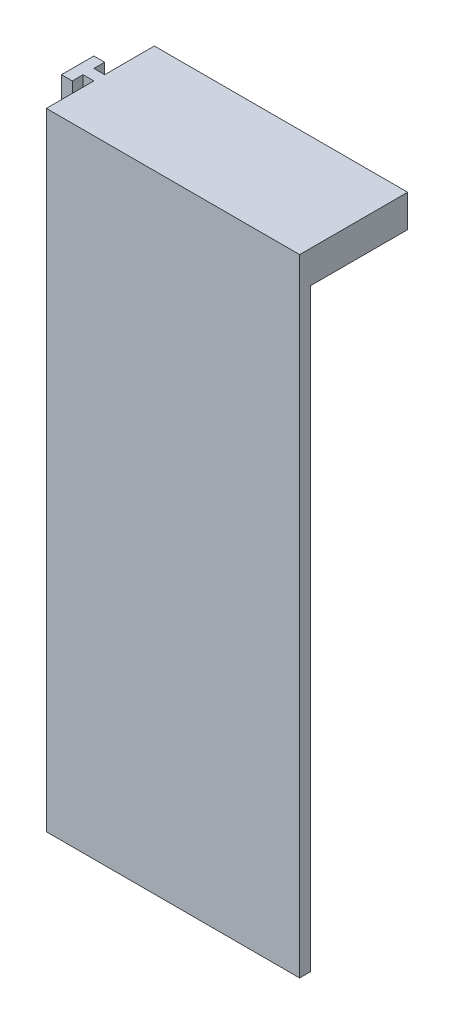
ISO-10303-21;
HEADER;
FILE_DESCRIPTION(('STEP AP214'),'2;1');
FILE_NAME('part.step','',(''),(''),'','','');
FILE_SCHEMA(('AUTOMOTIVE_DESIGN { 1 0 10303 214 1 1 1 1 }'));
ENDSEC;
DATA;
#1=APPLICATION_CONTEXT('core data for automotive mechanical design processes');
#2=APPLICATION_PROTOCOL_DEFINITION('international standard','automotive_design',2000,#1);
#3=PRODUCT_CONTEXT('',#1,'mechanical');
#4=PRODUCT('Part','Part','',(#3));
#5=PRODUCT_RELATED_PRODUCT_CATEGORY('part','',(#4));
#6=PRODUCT_DEFINITION_FORMATION('','',#4);
#7=PRODUCT_DEFINITION_CONTEXT('part definition',#1,'design');
#8=PRODUCT_DEFINITION('design','',#6,#7);
#9=PRODUCT_DEFINITION_SHAPE('','',#8);
#10=(LENGTH_UNIT() NAMED_UNIT(*) SI_UNIT(.MILLI.,.METRE.));
#11=(NAMED_UNIT(*) PLANE_ANGLE_UNIT() SI_UNIT($,.RADIAN.));
#12=(NAMED_UNIT(*) SI_UNIT($,.STERADIAN.) SOLID_ANGLE_UNIT());
#13=UNCERTAINTY_MEASURE_WITH_UNIT(LENGTH_MEASURE(1.E-05),#10,'distance_accuracy_value','');
#14=(GEOMETRIC_REPRESENTATION_CONTEXT(3) GLOBAL_UNCERTAINTY_ASSIGNED_CONTEXT((#13)) GLOBAL_UNIT_ASSIGNED_CONTEXT((#10,
#11,#12)) REPRESENTATION_CONTEXT('',''));
#15=CARTESIAN_POINT('',(0.,0.,0.));
#16=DIRECTION('',(0.,0.,1.));
#17=DIRECTION('',(1.,0.,0.));
#18=AXIS2_PLACEMENT_3D('',#15,#16,#17);
#19=CARTESIAN_POINT('',(-11.725,58.,-5.));
#20=DIRECTION('',(1.,0.,0.));
#21=DIRECTION('',(0.,0.,-1.));
#22=AXIS2_PLACEMENT_3D('',#19,#20,#21);
#23=PLANE('',#22);
#24=DIRECTION('',(0.,1.,0.));
#25=VECTOR('',#24,1.);
#26=CARTESIAN_POINT('',(-11.725,0.,0.599999999999998));
#27=LINE('',#26,#25);
#28=CARTESIAN_POINT('',(-11.725,0.,0.599999999999998));
#29=VERTEX_POINT('',#28);
#30=CARTESIAN_POINT('',(-11.725,58.,0.599999999999998));
#31=VERTEX_POINT('',#30);
#32=EDGE_CURVE('E209',#29,#31,#27,.T.);
#33=ORIENTED_EDGE('',*,*,#32,.F.);
#34=DIRECTION('',(0.,0.,1.));
#35=VECTOR('',#34,1.);
#36=CARTESIAN_POINT('',(-11.725,0.,-5.));
#37=LINE('',#36,#35);
#38=CARTESIAN_POINT('',(-11.725,0.,5.));
#39=VERTEX_POINT('',#38);
#40=EDGE_CURVE('E242',#29,#39,#37,.T.);
#41=ORIENTED_EDGE('',*,*,#40,.T.);
#42=DIRECTION('',(0.,-1.,0.));
#43=VECTOR('',#42,1.);
#44=CARTESIAN_POINT('',(-11.725,58.,5.));
#45=LINE('',#44,#43);
#46=CARTESIAN_POINT('',(-11.725,58.,5.));
#47=VERTEX_POINT('',#46);
#48=EDGE_CURVE('E249',#47,#39,#45,.T.);
#49=ORIENTED_EDGE('',*,*,#48,.F.);
#50=DIRECTION('',(0.,0.,1.));
#51=VECTOR('',#50,1.);
#52=CARTESIAN_POINT('',(-11.725,58.,-5.));
#53=LINE('',#52,#51);
#54=EDGE_CURVE('E231',#31,#47,#53,.T.);
#55=ORIENTED_EDGE('',*,*,#54,.F.);
#56=EDGE_LOOP('',(#33,#41,#49,#55));
#57=FACE_BOUND('',#56,.T.);
#58=ADVANCED_FACE('F33',(#57),#23,.F.);
#59=CARTESIAN_POINT('',(11.725,58.,-5.));
#60=DIRECTION('',(-1.,0.,0.));
#61=DIRECTION('',(0.,0.,1.));
#62=AXIS2_PLACEMENT_3D('',#59,#60,#61);
#63=PLANE('',#62);
#64=DIRECTION('',(0.,-1.,0.));
#65=VECTOR('',#64,1.);
#66=CARTESIAN_POINT('',(11.725,0.,4.01));
#67=LINE('',#66,#65);
#68=CARTESIAN_POINT('',(11.725,55.,4.01));
#69=VERTEX_POINT('',#68);
#70=CARTESIAN_POINT('',(11.725,0.,4.01));
#71=VERTEX_POINT('',#70);
#72=EDGE_CURVE('E48',#69,#71,#67,.T.);
#73=ORIENTED_EDGE('',*,*,#72,.F.);
#74=DIRECTION('',(0.,0.,-1.));
#75=VECTOR('',#74,1.);
#76=CARTESIAN_POINT('',(11.725,55.,4.01));
#77=LINE('',#76,#75);
#78=CARTESIAN_POINT('',(11.725,55.,-5.));
#79=VERTEX_POINT('',#78);
#80=EDGE_CURVE('E150',#69,#79,#77,.T.);
#81=ORIENTED_EDGE('',*,*,#80,.T.);
#82=DIRECTION('',(0.,-1.,0.));
#83=VECTOR('',#82,1.);
#84=CARTESIAN_POINT('',(11.725,58.,-5.));
#85=LINE('',#84,#83);
#86=CARTESIAN_POINT('',(11.725,58.,-5.));
#87=VERTEX_POINT('',#86);
#88=EDGE_CURVE('E11',#87,#79,#85,.T.);
#89=ORIENTED_EDGE('',*,*,#88,.F.);
#90=DIRECTION('',(0.,0.,-1.));
#91=VECTOR('',#90,1.);
#92=CARTESIAN_POINT('',(11.725,58.,-5.));
#93=LINE('',#92,#91);
#94=CARTESIAN_POINT('',(11.725,58.,5.));
#95=VERTEX_POINT('',#94);
#96=EDGE_CURVE('E225',#95,#87,#93,.T.);
#97=ORIENTED_EDGE('',*,*,#96,.F.);
#98=DIRECTION('',(0.,-1.,0.));
#99=VECTOR('',#98,1.);
#100=CARTESIAN_POINT('',(11.725,58.,5.));
#101=LINE('',#100,#99);
#102=CARTESIAN_POINT('',(11.725,0.,5.));
#103=VERTEX_POINT('',#102);
#104=EDGE_CURVE('E237',#95,#103,#101,.T.);
#105=ORIENTED_EDGE('',*,*,#104,.T.);
#106=DIRECTION('',(0.,0.,-1.));
#107=VECTOR('',#106,1.);
#108=CARTESIAN_POINT('',(11.725,0.,-5.));
#109=LINE('',#108,#107);
#110=EDGE_CURVE('E211',#103,#71,#109,.T.);
#111=ORIENTED_EDGE('',*,*,#110,.T.);
#112=EDGE_LOOP('',(#73,#81,#89,#97,#105,#111));
#113=FACE_BOUND('',#112,.T.);
#114=ADVANCED_FACE('F35',(#113),#63,.F.);
#115=CARTESIAN_POINT('',(-11.725,58.,-5.));
#116=DIRECTION('',(0.,0.,1.));
#117=DIRECTION('',(1.,0.,0.));
#118=AXIS2_PLACEMENT_3D('',#115,#116,#117);
#119=PLANE('',#118);
#120=DIRECTION('',(1.,0.,0.));
#121=VECTOR('',#120,1.);
#122=CARTESIAN_POINT('',(-11.625,55.,-5.));
#123=LINE('',#122,#121);
#124=CARTESIAN_POINT('',(-11.625,55.,-5.));
#125=VERTEX_POINT('',#124);
#126=EDGE_CURVE('E159',#125,#79,#123,.T.);
#127=ORIENTED_EDGE('',*,*,#126,.F.);
#128=DIRECTION('',(0.,1.,0.));
#129=VECTOR('',#128,1.);
#130=CARTESIAN_POINT('',(-11.625,0.,-5.));
#131=LINE('',#130,#129);
#132=CARTESIAN_POINT('',(-11.625,0.,-5.));
#133=VERTEX_POINT('',#132);
#134=EDGE_CURVE('E147',#133,#125,#131,.T.);
#135=ORIENTED_EDGE('',*,*,#134,.F.);
#136=DIRECTION('',(-1.,0.,0.));
#137=VECTOR('',#136,1.);
#138=CARTESIAN_POINT('',(-11.725,0.,-5.));
#139=LINE('',#138,#137);
#140=CARTESIAN_POINT('',(-11.725,0.,-5.));
#141=VERTEX_POINT('',#140);
#142=EDGE_CURVE('E240',#133,#141,#139,.T.);
#143=ORIENTED_EDGE('',*,*,#142,.T.);
#144=DIRECTION('',(0.,-1.,0.));
#145=VECTOR('',#144,1.);
#146=CARTESIAN_POINT('',(-11.725,58.,-5.));
#147=LINE('',#146,#145);
#148=CARTESIAN_POINT('',(-11.725,58.,-5.));
#149=VERTEX_POINT('',#148);
#150=EDGE_CURVE('E41',#149,#141,#147,.T.);
#151=ORIENTED_EDGE('',*,*,#150,.F.);
#152=DIRECTION('',(-1.,0.,0.));
#153=VECTOR('',#152,1.);
#154=CARTESIAN_POINT('',(-11.725,58.,-5.));
#155=LINE('',#154,#153);
#156=EDGE_CURVE('E228',#87,#149,#155,.T.);
#157=ORIENTED_EDGE('',*,*,#156,.F.);
#158=ORIENTED_EDGE('',*,*,#88,.T.);
#159=EDGE_LOOP('',(#127,#135,#143,#151,#157,#158));
#160=FACE_BOUND('',#159,.T.);
#161=ADVANCED_FACE('F270',(#160),#119,.F.);
#162=CARTESIAN_POINT('',(-11.725,0.,-0.400000000000001));
#163=VERTEX_POINT('',#162);
#164=EDGE_CURVE('E243',#141,#163,#37,.T.);
#165=ORIENTED_EDGE('',*,*,#164,.T.);
#166=DIRECTION('',(0.,1.,0.));
#167=VECTOR('',#166,1.);
#168=CARTESIAN_POINT('',(-11.725,0.,-0.400000000000001));
#169=LINE('',#168,#167);
#170=CARTESIAN_POINT('',(-11.725,58.,-0.400000000000001));
#171=VERTEX_POINT('',#170);
#172=EDGE_CURVE('E190',#163,#171,#169,.T.);
#173=ORIENTED_EDGE('',*,*,#172,.T.);
#174=EDGE_CURVE('E232',#149,#171,#53,.T.);
#175=ORIENTED_EDGE('',*,*,#174,.F.);
#176=ORIENTED_EDGE('',*,*,#150,.T.);
#177=EDGE_LOOP('',(#165,#173,#175,#176));
#178=FACE_BOUND('',#177,.T.);
#179=ADVANCED_FACE('F256',(#178),#23,.F.);
#180=CARTESIAN_POINT('',(-11.725,58.,5.));
#181=DIRECTION('',(0.,0.,-1.));
#182=DIRECTION('',(-1.,0.,0.));
#183=AXIS2_PLACEMENT_3D('',#180,#181,#182);
#184=PLANE('',#183);
#185=DIRECTION('',(1.,0.,0.));
#186=VECTOR('',#185,1.);
#187=CARTESIAN_POINT('',(-11.725,0.,5.));
#188=LINE('',#187,#186);
#189=EDGE_CURVE('E229',#39,#103,#188,.T.);
#190=ORIENTED_EDGE('',*,*,#189,.T.);
#191=ORIENTED_EDGE('',*,*,#104,.F.);
#192=DIRECTION('',(1.,0.,0.));
#193=VECTOR('',#192,1.);
#194=CARTESIAN_POINT('',(-11.725,58.,5.));
#195=LINE('',#194,#193);
#196=EDGE_CURVE('E235',#47,#95,#195,.T.);
#197=ORIENTED_EDGE('',*,*,#196,.F.);
#198=ORIENTED_EDGE('',*,*,#48,.T.);
#199=EDGE_LOOP('',(#190,#191,#197,#198));
#200=FACE_BOUND('',#199,.T.);
#201=ADVANCED_FACE('F278',(#200),#184,.F.);
#202=CARTESIAN_POINT('',(0.,58.,0.));
#203=DIRECTION('',(0.,1.,0.));
#204=DIRECTION('',(0.,0.,1.));
#205=AXIS2_PLACEMENT_3D('',#202,#203,#204);
#206=PLANE('',#205);
#207=ORIENTED_EDGE('',*,*,#96,.T.);
#208=ORIENTED_EDGE('',*,*,#156,.T.);
#209=ORIENTED_EDGE('',*,*,#174,.T.);
#210=DIRECTION('',(-1.,0.,0.));
#211=VECTOR('',#210,1.);
#212=CARTESIAN_POINT('',(-11.725,58.,-0.400000000000001));
#213=LINE('',#212,#211);
#214=CARTESIAN_POINT('',(-12.725,58.,-0.400000000000001));
#215=VERTEX_POINT('',#214);
#216=EDGE_CURVE('E56',#171,#215,#213,.T.);
#217=ORIENTED_EDGE('',*,*,#216,.T.);
#218=DIRECTION('',(0.,0.,-1.));
#219=VECTOR('',#218,1.);
#220=CARTESIAN_POINT('',(-12.725,58.,-0.400000000000001));
#221=LINE('',#220,#219);
#222=CARTESIAN_POINT('',(-12.725,58.,-1.4));
#223=VERTEX_POINT('',#222);
#224=EDGE_CURVE('E192',#215,#223,#221,.T.);
#225=ORIENTED_EDGE('',*,*,#224,.T.);
#226=DIRECTION('',(-1.,0.,0.));
#227=VECTOR('',#226,1.);
#228=CARTESIAN_POINT('',(-12.725,58.,-1.4));
#229=LINE('',#228,#227);
#230=CARTESIAN_POINT('',(-13.725,58.,-1.4));
#231=VERTEX_POINT('',#230);
#232=EDGE_CURVE('E195',#223,#231,#229,.T.);
#233=ORIENTED_EDGE('',*,*,#232,.T.);
#234=DIRECTION('',(0.,0.,1.));
#235=VECTOR('',#234,1.);
#236=CARTESIAN_POINT('',(-13.725,58.,-1.4));
#237=LINE('',#236,#235);
#238=CARTESIAN_POINT('',(-13.725,58.,1.60013631));
#239=VERTEX_POINT('',#238);
#240=EDGE_CURVE('E198',#231,#239,#237,.T.);
#241=ORIENTED_EDGE('',*,*,#240,.T.);
#242=DIRECTION('',(1.,0.,0.));
#243=VECTOR('',#242,1.);
#244=CARTESIAN_POINT('',(-13.725,58.,1.60013631));
#245=LINE('',#244,#243);
#246=CARTESIAN_POINT('',(-12.725,58.,1.60013631));
#247=VERTEX_POINT('',#246);
#248=EDGE_CURVE('E201',#239,#247,#245,.T.);
#249=ORIENTED_EDGE('',*,*,#248,.T.);
#250=DIRECTION('',(0.,0.,-1.));
#251=VECTOR('',#250,1.);
#252=CARTESIAN_POINT('',(-12.725,58.,1.60013631));
#253=LINE('',#252,#251);
#254=CARTESIAN_POINT('',(-12.725,58.,0.599999999999998));
#255=VERTEX_POINT('',#254);
#256=EDGE_CURVE('E204',#247,#255,#253,.T.);
#257=ORIENTED_EDGE('',*,*,#256,.T.);
#258=DIRECTION('',(1.,0.,0.));
#259=VECTOR('',#258,1.);
#260=CARTESIAN_POINT('',(-12.725,58.,0.599999999999998));
#261=LINE('',#260,#259);
#262=EDGE_CURVE('E173',#255,#31,#261,.T.);
#263=ORIENTED_EDGE('',*,*,#262,.T.);
#264=ORIENTED_EDGE('',*,*,#54,.T.);
#265=ORIENTED_EDGE('',*,*,#196,.T.);
#266=EDGE_LOOP('',(#207,#208,#209,#217,#225,#233,#241,#249,#257,#263,#264,#265));
#267=FACE_BOUND('',#266,.T.);
#268=ADVANCED_FACE('F267',(#267),#206,.T.);
#269=CARTESIAN_POINT('',(0.,0.,0.));
#270=DIRECTION('',(0.,1.,0.));
#271=DIRECTION('',(0.,0.,1.));
#272=AXIS2_PLACEMENT_3D('',#269,#270,#271);
#273=PLANE('',#272);
#274=ORIENTED_EDGE('',*,*,#142,.F.);
#275=DIRECTION('',(0.,0.,-1.));
#276=VECTOR('',#275,1.);
#277=CARTESIAN_POINT('',(-11.625,0.,4.01));
#278=LINE('',#277,#276);
#279=CARTESIAN_POINT('',(-11.625,0.,4.01));
#280=VERTEX_POINT('',#279);
#281=EDGE_CURVE('E166',#280,#133,#278,.T.);
#282=ORIENTED_EDGE('',*,*,#281,.F.);
#283=DIRECTION('',(-1.,0.,0.));
#284=VECTOR('',#283,1.);
#285=CARTESIAN_POINT('',(-11.625,0.,4.01));
#286=LINE('',#285,#284);
#287=EDGE_CURVE('E151',#71,#280,#286,.T.);
#288=ORIENTED_EDGE('',*,*,#287,.F.);
#289=ORIENTED_EDGE('',*,*,#110,.F.);
#290=ORIENTED_EDGE('',*,*,#189,.F.);
#291=ORIENTED_EDGE('',*,*,#40,.F.);
#292=DIRECTION('',(1.,0.,0.));
#293=VECTOR('',#292,1.);
#294=CARTESIAN_POINT('',(-12.725,0.,0.599999999999998));
#295=LINE('',#294,#293);
#296=CARTESIAN_POINT('',(-12.725,0.,0.599999999999998));
#297=VERTEX_POINT('',#296);
#298=EDGE_CURVE('E188',#297,#29,#295,.T.);
#299=ORIENTED_EDGE('',*,*,#298,.F.);
#300=DIRECTION('',(0.,0.,-1.));
#301=VECTOR('',#300,1.);
#302=CARTESIAN_POINT('',(-12.725,0.,1.60013631));
#303=LINE('',#302,#301);
#304=CARTESIAN_POINT('',(-12.725,0.,1.60013631));
#305=VERTEX_POINT('',#304);
#306=EDGE_CURVE('E185',#305,#297,#303,.T.);
#307=ORIENTED_EDGE('',*,*,#306,.F.);
#308=DIRECTION('',(1.,0.,0.));
#309=VECTOR('',#308,1.);
#310=CARTESIAN_POINT('',(-13.725,0.,1.60013631));
#311=LINE('',#310,#309);
#312=CARTESIAN_POINT('',(-13.725,0.,1.60013631));
#313=VERTEX_POINT('',#312);
#314=EDGE_CURVE('E182',#313,#305,#311,.T.);
#315=ORIENTED_EDGE('',*,*,#314,.F.);
#316=DIRECTION('',(0.,0.,1.));
#317=VECTOR('',#316,1.);
#318=CARTESIAN_POINT('',(-13.725,0.,-1.4));
#319=LINE('',#318,#317);
#320=CARTESIAN_POINT('',(-13.725,0.,-1.4));
#321=VERTEX_POINT('',#320);
#322=EDGE_CURVE('E179',#321,#313,#319,.T.);
#323=ORIENTED_EDGE('',*,*,#322,.F.);
#324=DIRECTION('',(-1.,0.,0.));
#325=VECTOR('',#324,1.);
#326=CARTESIAN_POINT('',(-12.725,0.,-1.4));
#327=LINE('',#326,#325);
#328=CARTESIAN_POINT('',(-12.725,0.,-1.4));
#329=VERTEX_POINT('',#328);
#330=EDGE_CURVE('E176',#329,#321,#327,.T.);
#331=ORIENTED_EDGE('',*,*,#330,.F.);
#332=DIRECTION('',(0.,0.,-1.));
#333=VECTOR('',#332,1.);
#334=CARTESIAN_POINT('',(-12.725,0.,-0.400000000000001));
#335=LINE('',#334,#333);
#336=CARTESIAN_POINT('',(-12.725,0.,-0.400000000000001));
#337=VERTEX_POINT('',#336);
#338=EDGE_CURVE('E172',#337,#329,#335,.T.);
#339=ORIENTED_EDGE('',*,*,#338,.F.);
#340=DIRECTION('',(-1.,0.,0.));
#341=VECTOR('',#340,1.);
#342=CARTESIAN_POINT('',(-11.725,0.,-0.400000000000001));
#343=LINE('',#342,#341);
#344=EDGE_CURVE('E169',#163,#337,#343,.T.);
#345=ORIENTED_EDGE('',*,*,#344,.F.);
#346=ORIENTED_EDGE('',*,*,#164,.F.);
#347=EDGE_LOOP('',(#274,#282,#288,#289,#290,#291,#299,#307,#315,#323,#331,#339,#345,#346));
#348=FACE_BOUND('',#347,.T.);
#349=ADVANCED_FACE('F261',(#348),#273,.F.);
#350=CARTESIAN_POINT('',(-12.725,0.,0.599999999999998));
#351=DIRECTION('',(0.,0.,1.));
#352=DIRECTION('',(1.,0.,0.));
#353=AXIS2_PLACEMENT_3D('',#350,#351,#352);
#354=PLANE('',#353);
#355=ORIENTED_EDGE('',*,*,#262,.F.);
#356=DIRECTION('',(0.,1.,0.));
#357=VECTOR('',#356,1.);
#358=CARTESIAN_POINT('',(-12.725,0.,0.599999999999998));
#359=LINE('',#358,#357);
#360=EDGE_CURVE('E212',#297,#255,#359,.T.);
#361=ORIENTED_EDGE('',*,*,#360,.F.);
#362=ORIENTED_EDGE('',*,*,#298,.T.);
#363=ORIENTED_EDGE('',*,*,#32,.T.);
#364=EDGE_LOOP('',(#355,#361,#362,#363));
#365=FACE_BOUND('',#364,.T.);
#366=ADVANCED_FACE('F286',(#365),#354,.T.);
#367=CARTESIAN_POINT('',(-12.725,0.,1.60013631));
#368=DIRECTION('',(1.,0.,0.));
#369=DIRECTION('',(0.,0.,-1.));
#370=AXIS2_PLACEMENT_3D('',#367,#368,#369);
#371=PLANE('',#370);
#372=ORIENTED_EDGE('',*,*,#256,.F.);
#373=DIRECTION('',(0.,1.,0.));
#374=VECTOR('',#373,1.);
#375=CARTESIAN_POINT('',(-12.725,0.,1.60013631));
#376=LINE('',#375,#374);
#377=EDGE_CURVE('E214',#305,#247,#376,.T.);
#378=ORIENTED_EDGE('',*,*,#377,.F.);
#379=ORIENTED_EDGE('',*,*,#306,.T.);
#380=ORIENTED_EDGE('',*,*,#360,.T.);
#381=EDGE_LOOP('',(#372,#378,#379,#380));
#382=FACE_BOUND('',#381,.T.);
#383=ADVANCED_FACE('F290',(#382),#371,.T.);
#384=CARTESIAN_POINT('',(-13.725,0.,1.60013631));
#385=DIRECTION('',(0.,0.,1.));
#386=DIRECTION('',(1.,0.,0.));
#387=AXIS2_PLACEMENT_3D('',#384,#385,#386);
#388=PLANE('',#387);
#389=ORIENTED_EDGE('',*,*,#248,.F.);
#390=DIRECTION('',(0.,1.,0.));
#391=VECTOR('',#390,1.);
#392=CARTESIAN_POINT('',(-13.725,0.,1.60013631));
#393=LINE('',#392,#391);
#394=EDGE_CURVE('E216',#313,#239,#393,.T.);
#395=ORIENTED_EDGE('',*,*,#394,.F.);
#396=ORIENTED_EDGE('',*,*,#314,.T.);
#397=ORIENTED_EDGE('',*,*,#377,.T.);
#398=EDGE_LOOP('',(#389,#395,#396,#397));
#399=FACE_BOUND('',#398,.T.);
#400=ADVANCED_FACE('F295',(#399),#388,.T.);
#401=CARTESIAN_POINT('',(-13.725,0.,-1.4));
#402=DIRECTION('',(-1.,0.,0.));
#403=DIRECTION('',(0.,0.,1.));
#404=AXIS2_PLACEMENT_3D('',#401,#402,#403);
#405=PLANE('',#404);
#406=ORIENTED_EDGE('',*,*,#240,.F.);
#407=DIRECTION('',(0.,1.,0.));
#408=VECTOR('',#407,1.);
#409=CARTESIAN_POINT('',(-13.725,0.,-1.4));
#410=LINE('',#409,#408);
#411=EDGE_CURVE('E218',#321,#231,#410,.T.);
#412=ORIENTED_EDGE('',*,*,#411,.F.);
#413=ORIENTED_EDGE('',*,*,#322,.T.);
#414=ORIENTED_EDGE('',*,*,#394,.T.);
#415=EDGE_LOOP('',(#406,#412,#413,#414));
#416=FACE_BOUND('',#415,.T.);
#417=ADVANCED_FACE('F298',(#416),#405,.T.);
#418=CARTESIAN_POINT('',(-12.725,0.,-1.4));
#419=DIRECTION('',(0.,0.,-1.));
#420=DIRECTION('',(-1.,0.,0.));
#421=AXIS2_PLACEMENT_3D('',#418,#419,#420);
#422=PLANE('',#421);
#423=ORIENTED_EDGE('',*,*,#232,.F.);
#424=DIRECTION('',(0.,1.,0.));
#425=VECTOR('',#424,1.);
#426=CARTESIAN_POINT('',(-12.725,0.,-1.4));
#427=LINE('',#426,#425);
#428=EDGE_CURVE('E220',#329,#223,#427,.T.);
#429=ORIENTED_EDGE('',*,*,#428,.F.);
#430=ORIENTED_EDGE('',*,*,#330,.T.);
#431=ORIENTED_EDGE('',*,*,#411,.T.);
#432=EDGE_LOOP('',(#423,#429,#430,#431));
#433=FACE_BOUND('',#432,.T.);
#434=ADVANCED_FACE('F301',(#433),#422,.T.);
#435=CARTESIAN_POINT('',(-12.725,0.,-0.400000000000001));
#436=DIRECTION('',(1.,0.,0.));
#437=DIRECTION('',(0.,0.,-1.));
#438=AXIS2_PLACEMENT_3D('',#435,#436,#437);
#439=PLANE('',#438);
#440=ORIENTED_EDGE('',*,*,#224,.F.);
#441=DIRECTION('',(0.,1.,0.));
#442=VECTOR('',#441,1.);
#443=CARTESIAN_POINT('',(-12.725,0.,-0.400000000000001));
#444=LINE('',#443,#442);
#445=EDGE_CURVE('E222',#337,#215,#444,.T.);
#446=ORIENTED_EDGE('',*,*,#445,.F.);
#447=ORIENTED_EDGE('',*,*,#338,.T.);
#448=ORIENTED_EDGE('',*,*,#428,.T.);
#449=EDGE_LOOP('',(#440,#446,#447,#448));
#450=FACE_BOUND('',#449,.T.);
#451=ADVANCED_FACE('F303',(#450),#439,.T.);
#452=CARTESIAN_POINT('',(-11.725,0.,-0.400000000000001));
#453=DIRECTION('',(0.,0.,-1.));
#454=DIRECTION('',(-1.,0.,0.));
#455=AXIS2_PLACEMENT_3D('',#452,#453,#454);
#456=PLANE('',#455);
#457=ORIENTED_EDGE('',*,*,#216,.F.);
#458=ORIENTED_EDGE('',*,*,#172,.F.);
#459=ORIENTED_EDGE('',*,*,#344,.T.);
#460=ORIENTED_EDGE('',*,*,#445,.T.);
#461=EDGE_LOOP('',(#457,#458,#459,#460));
#462=FACE_BOUND('',#461,.T.);
#463=ADVANCED_FACE('F264',(#462),#456,.T.);
#464=CARTESIAN_POINT('',(-11.625,0.,4.01));
#465=DIRECTION('',(-1.,0.,0.));
#466=DIRECTION('',(0.,0.,1.));
#467=AXIS2_PLACEMENT_3D('',#464,#465,#466);
#468=PLANE('',#467);
#469=ORIENTED_EDGE('',*,*,#134,.T.);
#470=DIRECTION('',(0.,0.,-1.));
#471=VECTOR('',#470,1.);
#472=CARTESIAN_POINT('',(-11.625,55.,4.01));
#473=LINE('',#472,#471);
#474=CARTESIAN_POINT('',(-11.625,55.,4.01));
#475=VERTEX_POINT('',#474);
#476=EDGE_CURVE('E141',#475,#125,#473,.T.);
#477=ORIENTED_EDGE('',*,*,#476,.F.);
#478=DIRECTION('',(0.,1.,0.));
#479=VECTOR('',#478,1.);
#480=CARTESIAN_POINT('',(-11.625,0.,4.01));
#481=LINE('',#480,#479);
#482=EDGE_CURVE('E145',#280,#475,#481,.T.);
#483=ORIENTED_EDGE('',*,*,#482,.F.);
#484=ORIENTED_EDGE('',*,*,#281,.T.);
#485=EDGE_LOOP('',(#469,#477,#483,#484));
#486=FACE_BOUND('',#485,.T.);
#487=ADVANCED_FACE('F143',(#486),#468,.F.);
#488=CARTESIAN_POINT('',(-11.625,55.,4.01));
#489=DIRECTION('',(0.,1.,0.));
#490=DIRECTION('',(0.,0.,1.));
#491=AXIS2_PLACEMENT_3D('',#488,#489,#490);
#492=PLANE('',#491);
#493=ORIENTED_EDGE('',*,*,#126,.T.);
#494=ORIENTED_EDGE('',*,*,#80,.F.);
#495=DIRECTION('',(1.,0.,0.));
#496=VECTOR('',#495,1.);
#497=CARTESIAN_POINT('',(-11.625,55.,4.01));
#498=LINE('',#497,#496);
#499=EDGE_CURVE('E153',#475,#69,#498,.T.);
#500=ORIENTED_EDGE('',*,*,#499,.F.);
#501=ORIENTED_EDGE('',*,*,#476,.T.);
#502=EDGE_LOOP('',(#493,#494,#500,#501));
#503=FACE_BOUND('',#502,.T.);
#504=ADVANCED_FACE('F154',(#503),#492,.F.);
#505=CARTESIAN_POINT('',(0.,0.,4.01));
#506=DIRECTION('',(0.,0.,-1.));
#507=DIRECTION('',(-1.,0.,0.));
#508=AXIS2_PLACEMENT_3D('',#505,#506,#507);
#509=PLANE('',#508);
#510=ORIENTED_EDGE('',*,*,#482,.T.);
#511=ORIENTED_EDGE('',*,*,#499,.T.);
#512=ORIENTED_EDGE('',*,*,#72,.T.);
#513=ORIENTED_EDGE('',*,*,#287,.T.);
#514=EDGE_LOOP('',(#510,#511,#512,#513));
#515=FACE_BOUND('',#514,.T.);
#516=ADVANCED_FACE('F157',(#515),#509,.T.);
#517=CLOSED_SHELL('',(#58,#114,#161,#179,#201,#268,#349,#366,#383,#400,#417,#434,#451,#463,#487,
#504,#516));
#518=MANIFOLD_SOLID_BREP('B2',#517);
#519=ADVANCED_BREP_SHAPE_REPRESENTATION('',(#18,#518),#14);
#520=SHAPE_DEFINITION_REPRESENTATION(#9,#519);
ENDSEC;
END-ISO-10303-21;
